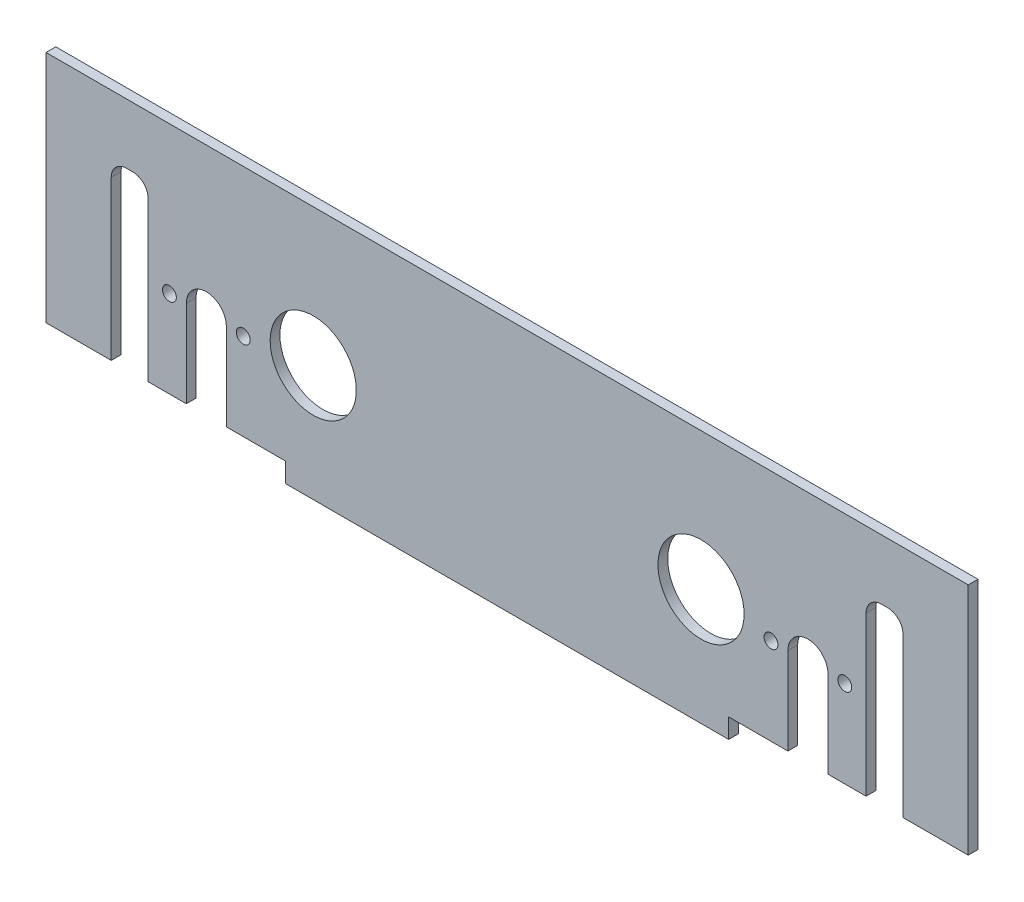
ISO-10303-21;
HEADER;
FILE_DESCRIPTION(('STEP AP214'),'2;1');
FILE_NAME('part.step','',(''),(''),'','','');
FILE_SCHEMA(('AUTOMOTIVE_DESIGN { 1 0 10303 214 1 1 1 1 }'));
ENDSEC;
DATA;
#1=APPLICATION_CONTEXT('core data for automotive mechanical design processes');
#2=APPLICATION_PROTOCOL_DEFINITION('international standard','automotive_design',2000,#1);
#3=PRODUCT_CONTEXT('',#1,'mechanical');
#4=PRODUCT('Part','Part','',(#3));
#5=PRODUCT_RELATED_PRODUCT_CATEGORY('part','',(#4));
#6=PRODUCT_DEFINITION_FORMATION('','',#4);
#7=PRODUCT_DEFINITION_CONTEXT('part definition',#1,'design');
#8=PRODUCT_DEFINITION('design','',#6,#7);
#9=PRODUCT_DEFINITION_SHAPE('','',#8);
#10=(LENGTH_UNIT() NAMED_UNIT(*) SI_UNIT(.MILLI.,.METRE.));
#11=(NAMED_UNIT(*) PLANE_ANGLE_UNIT() SI_UNIT($,.RADIAN.));
#12=(NAMED_UNIT(*) SI_UNIT($,.STERADIAN.) SOLID_ANGLE_UNIT());
#13=UNCERTAINTY_MEASURE_WITH_UNIT(LENGTH_MEASURE(1.E-05),#10,'distance_accuracy_value','');
#14=(GEOMETRIC_REPRESENTATION_CONTEXT(3) GLOBAL_UNCERTAINTY_ASSIGNED_CONTEXT((#13)) GLOBAL_UNIT_ASSIGNED_CONTEXT((#10,
#11,#12)) REPRESENTATION_CONTEXT('',''));
#15=CARTESIAN_POINT('',(0.,0.,0.));
#16=DIRECTION('',(0.,0.,1.));
#17=DIRECTION('',(1.,0.,0.));
#18=AXIS2_PLACEMENT_3D('',#15,#16,#17);
#19=CARTESIAN_POINT('',(-149.85,-38.0375,3.175));
#20=DIRECTION('',(0.,1.,0.));
#21=DIRECTION('',(0.,0.,1.));
#22=AXIS2_PLACEMENT_3D('',#19,#20,#21);
#23=PLANE('',#22);
#24=DIRECTION('',(0.,0.,1.));
#25=VECTOR('',#24,1.);
#26=CARTESIAN_POINT('',(72.,-38.0375,3.175));
#27=LINE('',#26,#25);
#28=CARTESIAN_POINT('',(72.,-38.0375,0.));
#29=VERTEX_POINT('',#28);
#30=CARTESIAN_POINT('',(72.,-38.0375,3.175));
#31=VERTEX_POINT('',#30);
#32=EDGE_CURVE('E252',#29,#31,#27,.T.);
#33=ORIENTED_EDGE('',*,*,#32,.F.);
#34=DIRECTION('',(1.,0.,0.));
#35=VECTOR('',#34,1.);
#36=CARTESIAN_POINT('',(-149.85,-38.0375,0.));
#37=LINE('',#36,#35);
#38=CARTESIAN_POINT('',(91.25,-38.0375,0.));
#39=VERTEX_POINT('',#38);
#40=EDGE_CURVE('E439',#29,#39,#37,.T.);
#41=ORIENTED_EDGE('',*,*,#40,.T.);
#42=DIRECTION('',(0.,0.,-1.));
#43=VECTOR('',#42,1.);
#44=CARTESIAN_POINT('',(91.25,-38.0375,3.175));
#45=LINE('',#44,#43);
#46=CARTESIAN_POINT('',(91.25,-38.0375,3.175));
#47=VERTEX_POINT('',#46);
#48=EDGE_CURVE('E305',#47,#39,#45,.T.);
#49=ORIENTED_EDGE('',*,*,#48,.F.);
#50=DIRECTION('',(1.,0.,0.));
#51=VECTOR('',#50,1.);
#52=CARTESIAN_POINT('',(-149.85,-38.0375,3.175));
#53=LINE('',#52,#51);
#54=EDGE_CURVE('E64',#31,#47,#53,.T.);
#55=ORIENTED_EDGE('',*,*,#54,.F.);
#56=EDGE_LOOP('',(#33,#41,#49,#55));
#57=FACE_BOUND('',#56,.T.);
#58=ADVANCED_FACE('F41',(#57),#23,.F.);
#59=DIRECTION('',(0.,0.,-1.));
#60=VECTOR('',#59,1.);
#61=CARTESIAN_POINT('',(-72.,-38.0375,3.175));
#62=LINE('',#61,#60);
#63=CARTESIAN_POINT('',(-72.,-38.0375,3.175));
#64=VERTEX_POINT('',#63);
#65=CARTESIAN_POINT('',(-72.,-38.0375,0.));
#66=VERTEX_POINT('',#65);
#67=EDGE_CURVE('E249',#64,#66,#62,.T.);
#68=ORIENTED_EDGE('',*,*,#67,.F.);
#69=CARTESIAN_POINT('',(-91.2500000000002,-38.0375,3.175));
#70=VERTEX_POINT('',#69);
#71=EDGE_CURVE('E486',#70,#64,#53,.T.);
#72=ORIENTED_EDGE('',*,*,#71,.F.);
#73=DIRECTION('',(0.,0.,-1.));
#74=VECTOR('',#73,1.);
#75=CARTESIAN_POINT('',(-91.2500000000002,-38.0375,3.175));
#76=LINE('',#75,#74);
#77=CARTESIAN_POINT('',(-91.2500000000002,-38.0375,0.));
#78=VERTEX_POINT('',#77);
#79=EDGE_CURVE('E331',#70,#78,#76,.T.);
#80=ORIENTED_EDGE('',*,*,#79,.T.);
#81=EDGE_CURVE('E56',#78,#66,#37,.T.);
#82=ORIENTED_EDGE('',*,*,#81,.T.);
#83=EDGE_LOOP('',(#68,#72,#80,#82));
#84=FACE_BOUND('',#83,.T.);
#85=ADVANCED_FACE('F508',(#84),#23,.F.);
#86=CARTESIAN_POINT('',(0.,0.,3.175));
#87=DIRECTION('',(0.,0.,1.));
#88=DIRECTION('',(1.,0.,0.));
#89=AXIS2_PLACEMENT_3D('',#86,#87,#88);
#90=PLANE('',#89);
#91=CARTESIAN_POINT('',(63.0088992226956,-6.64465154463759,3.17500000000054));
#92=DIRECTION('',(0.,0.,1.));
#93=DIRECTION('',(1.,0.,0.));
#94=AXIS2_PLACEMENT_3D('',#91,#92,#93);
#95=CIRCLE('',#94,14.);
#96=CARTESIAN_POINT('',(77.0088992226956,-6.64465154463759,3.17500000000054));
#97=VERTEX_POINT('',#96);
#98=EDGE_CURVE('E524',#97,#97,#95,.T.);
#99=ORIENTED_EDGE('',*,*,#98,.F.);
#100=EDGE_LOOP('',(#99));
#101=FACE_BOUND('',#100,.T.);
#102=CARTESIAN_POINT('',(-63.0088992226956,-6.64465154463759,3.17500000000054));
#103=DIRECTION('',(0.,0.,-1.));
#104=DIRECTION('',(-1.,0.,0.));
#105=AXIS2_PLACEMENT_3D('',#102,#103,#104);
#106=CIRCLE('',#105,14.);
#107=CARTESIAN_POINT('',(-77.0088992226956,-6.64465154463759,3.17500000000054));
#108=VERTEX_POINT('',#107);
#109=EDGE_CURVE('E513',#108,#108,#106,.T.);
#110=ORIENTED_EDGE('',*,*,#109,.T.);
#111=EDGE_LOOP('',(#110));
#112=FACE_BOUND('',#111,.T.);
#113=CARTESIAN_POINT('',(109.75,-9.7625,3.17500000000054));
#114=DIRECTION('',(0.,0.,-1.));
#115=DIRECTION('',(-1.,0.,0.));
#116=AXIS2_PLACEMENT_3D('',#113,#114,#115);
#117=CIRCLE('',#116,2.25);
#118=CARTESIAN_POINT('',(107.5,-9.7625,3.17500000000054));
#119=VERTEX_POINT('',#118);
#120=EDGE_CURVE('E267',#119,#119,#117,.T.);
#121=ORIENTED_EDGE('',*,*,#120,.T.);
#122=EDGE_LOOP('',(#121));
#123=FACE_BOUND('',#122,.T.);
#124=ORIENTED_EDGE('',*,*,#71,.T.);
#125=DIRECTION('',(0.,1.,0.));
#126=VECTOR('',#125,1.);
#127=CARTESIAN_POINT('',(-72.,-44.3875,3.175));
#128=LINE('',#127,#126);
#129=CARTESIAN_POINT('',(-72.,-44.3875,3.175));
#130=VERTEX_POINT('',#129);
#131=EDGE_CURVE('E236',#130,#64,#128,.T.);
#132=ORIENTED_EDGE('',*,*,#131,.F.);
#133=DIRECTION('',(-1.,0.,0.));
#134=VECTOR('',#133,1.);
#135=CARTESIAN_POINT('',(-72.,-44.3875,3.175));
#136=LINE('',#135,#134);
#137=CARTESIAN_POINT('',(72.,-44.3875,3.175));
#138=VERTEX_POINT('',#137);
#139=EDGE_CURVE('E227',#138,#130,#136,.T.);
#140=ORIENTED_EDGE('',*,*,#139,.F.);
#141=DIRECTION('',(0.,1.,0.));
#142=VECTOR('',#141,1.);
#143=CARTESIAN_POINT('',(72.,-44.3875,3.175));
#144=LINE('',#143,#142);
#145=EDGE_CURVE('E233',#138,#31,#144,.T.);
#146=ORIENTED_EDGE('',*,*,#145,.T.);
#147=ORIENTED_EDGE('',*,*,#54,.T.);
#148=DIRECTION('',(0.,-1.,0.));
#149=VECTOR('',#148,1.);
#150=CARTESIAN_POINT('',(91.25,0.,3.175));
#151=LINE('',#150,#149);
#152=CARTESIAN_POINT('',(91.25,-9.76249999999999,3.175));
#153=VERTEX_POINT('',#152);
#154=EDGE_CURVE('E290',#153,#47,#151,.T.);
#155=ORIENTED_EDGE('',*,*,#154,.F.);
#156=CARTESIAN_POINT('',(97.75,-9.76249999999999,3.175));
#157=DIRECTION('',(0.,0.,-1.));
#158=DIRECTION('',(-1.,0.,0.));
#159=AXIS2_PLACEMENT_3D('',#156,#157,#158);
#160=CIRCLE('',#159,6.5);
#161=CARTESIAN_POINT('',(104.25,-9.76249999999999,3.175));
#162=VERTEX_POINT('',#161);
#163=EDGE_CURVE('E283',#153,#162,#160,.T.);
#164=ORIENTED_EDGE('',*,*,#163,.T.);
#165=DIRECTION('',(0.,-1.,0.));
#166=VECTOR('',#165,1.);
#167=CARTESIAN_POINT('',(104.25,0.,3.175));
#168=LINE('',#167,#166);
#169=CARTESIAN_POINT('',(104.25,-38.0375,3.175));
#170=VERTEX_POINT('',#169);
#171=EDGE_CURVE('E286',#162,#170,#168,.T.);
#172=ORIENTED_EDGE('',*,*,#171,.T.);
#173=CARTESIAN_POINT('',(116.65,-38.0375,3.175));
#174=VERTEX_POINT('',#173);
#175=EDGE_CURVE('E487',#170,#174,#53,.T.);
#176=ORIENTED_EDGE('',*,*,#175,.T.);
#177=DIRECTION('',(0.,1.,0.));
#178=VECTOR('',#177,1.);
#179=CARTESIAN_POINT('',(116.65,0.,3.175));
#180=LINE('',#179,#178);
#181=CARTESIAN_POINT('',(116.65,13.5125,3.175));
#182=VERTEX_POINT('',#181);
#183=EDGE_CURVE('E363',#174,#182,#180,.T.);
#184=ORIENTED_EDGE('',*,*,#183,.T.);
#185=CARTESIAN_POINT('',(121.65,13.5125,3.175));
#186=DIRECTION('',(0.,0.,1.));
#187=DIRECTION('',(1.,0.,0.));
#188=AXIS2_PLACEMENT_3D('',#185,#186,#187);
#189=CIRCLE('',#188,5.00000000000001);
#190=CARTESIAN_POINT('',(121.65,18.5125,3.175));
#191=VERTEX_POINT('',#190);
#192=EDGE_CURVE('E377',#191,#182,#189,.T.);
#193=ORIENTED_EDGE('',*,*,#192,.F.);
#194=DIRECTION('',(1.,0.,0.));
#195=VECTOR('',#194,1.);
#196=CARTESIAN_POINT('',(0.,18.5125,3.175));
#197=LINE('',#196,#195);
#198=CARTESIAN_POINT('',(123.65,18.5125,3.175));
#199=VERTEX_POINT('',#198);
#200=EDGE_CURVE('E397',#191,#199,#197,.T.);
#201=ORIENTED_EDGE('',*,*,#200,.T.);
#202=CARTESIAN_POINT('',(123.65,13.5125,3.175));
#203=DIRECTION('',(0.,0.,1.));
#204=DIRECTION('',(1.,0.,0.));
#205=AXIS2_PLACEMENT_3D('',#202,#203,#204);
#206=CIRCLE('',#205,5.00000000000001);
#207=CARTESIAN_POINT('',(128.65,13.5125,3.175));
#208=VERTEX_POINT('',#207);
#209=EDGE_CURVE('E394',#208,#199,#206,.T.);
#210=ORIENTED_EDGE('',*,*,#209,.F.);
#211=DIRECTION('',(0.,1.,0.));
#212=VECTOR('',#211,1.);
#213=CARTESIAN_POINT('',(128.65,0.,3.175));
#214=LINE('',#213,#212);
#215=CARTESIAN_POINT('',(128.65,-38.0375,3.175));
#216=VERTEX_POINT('',#215);
#217=EDGE_CURVE('E391',#216,#208,#214,.T.);
#218=ORIENTED_EDGE('',*,*,#217,.F.);
#219=CARTESIAN_POINT('',(149.85,-38.0375,3.175));
#220=VERTEX_POINT('',#219);
#221=EDGE_CURVE('E423',#216,#220,#53,.T.);
#222=ORIENTED_EDGE('',*,*,#221,.T.);
#223=DIRECTION('',(0.,1.,0.));
#224=VECTOR('',#223,1.);
#225=CARTESIAN_POINT('',(149.85,38.0375,3.175));
#226=LINE('',#225,#224);
#227=CARTESIAN_POINT('',(149.85,38.0375,3.175));
#228=VERTEX_POINT('',#227);
#229=EDGE_CURVE('E415',#220,#228,#226,.T.);
#230=ORIENTED_EDGE('',*,*,#229,.T.);
#231=DIRECTION('',(-1.,0.,0.));
#232=VECTOR('',#231,1.);
#233=CARTESIAN_POINT('',(-149.85,38.0375,3.175));
#234=LINE('',#233,#232);
#235=CARTESIAN_POINT('',(-149.85,38.0375,3.175));
#236=VERTEX_POINT('',#235);
#237=EDGE_CURVE('E418',#228,#236,#234,.T.);
#238=ORIENTED_EDGE('',*,*,#237,.T.);
#239=DIRECTION('',(0.,-1.,0.));
#240=VECTOR('',#239,1.);
#241=CARTESIAN_POINT('',(-149.85,38.0375,3.175));
#242=LINE('',#241,#240);
#243=CARTESIAN_POINT('',(-149.85,-38.0375,3.175));
#244=VERTEX_POINT('',#243);
#245=EDGE_CURVE('E421',#236,#244,#242,.T.);
#246=ORIENTED_EDGE('',*,*,#245,.T.);
#247=CARTESIAN_POINT('',(-128.65,-38.0375,3.175));
#248=VERTEX_POINT('',#247);
#249=EDGE_CURVE('E424',#244,#248,#53,.T.);
#250=ORIENTED_EDGE('',*,*,#249,.T.);
#251=DIRECTION('',(0.,1.,0.));
#252=VECTOR('',#251,1.);
#253=CARTESIAN_POINT('',(-128.65,0.,3.175));
#254=LINE('',#253,#252);
#255=CARTESIAN_POINT('',(-128.65,13.5125,3.175));
#256=VERTEX_POINT('',#255);
#257=EDGE_CURVE('E338',#248,#256,#254,.T.);
#258=ORIENTED_EDGE('',*,*,#257,.T.);
#259=CARTESIAN_POINT('',(-123.65,13.5125,3.175));
#260=DIRECTION('',(0.,0.,-1.));
#261=DIRECTION('',(-1.,0.,0.));
#262=AXIS2_PLACEMENT_3D('',#259,#260,#261);
#263=CIRCLE('',#262,5.00000000000001);
#264=CARTESIAN_POINT('',(-123.65,18.5125,3.175));
#265=VERTEX_POINT('',#264);
#266=EDGE_CURVE('E356',#256,#265,#263,.T.);
#267=ORIENTED_EDGE('',*,*,#266,.T.);
#268=DIRECTION('',(-1.,0.,0.));
#269=VECTOR('',#268,1.);
#270=CARTESIAN_POINT('',(0.,18.5125,3.175));
#271=LINE('',#270,#269);
#272=CARTESIAN_POINT('',(-121.65,18.5125,3.175));
#273=VERTEX_POINT('',#272);
#274=EDGE_CURVE('E353',#273,#265,#271,.T.);
#275=ORIENTED_EDGE('',*,*,#274,.F.);
#276=CARTESIAN_POINT('',(-121.65,13.5125,3.175));
#277=DIRECTION('',(0.,0.,-1.));
#278=DIRECTION('',(-1.,0.,0.));
#279=AXIS2_PLACEMENT_3D('',#276,#277,#278);
#280=CIRCLE('',#279,5.00000000000001);
#281=CARTESIAN_POINT('',(-116.65,13.5125,3.175));
#282=VERTEX_POINT('',#281);
#283=EDGE_CURVE('E350',#273,#282,#280,.T.);
#284=ORIENTED_EDGE('',*,*,#283,.T.);
#285=DIRECTION('',(0.,1.,0.));
#286=VECTOR('',#285,1.);
#287=CARTESIAN_POINT('',(-116.65,0.,3.175));
#288=LINE('',#287,#286);
#289=CARTESIAN_POINT('',(-116.65,-38.0375,3.175));
#290=VERTEX_POINT('',#289);
#291=EDGE_CURVE('E304',#290,#282,#288,.T.);
#292=ORIENTED_EDGE('',*,*,#291,.F.);
#293=CARTESIAN_POINT('',(-104.25,-38.0375,3.175));
#294=VERTEX_POINT('',#293);
#295=EDGE_CURVE('E428',#290,#294,#53,.T.);
#296=ORIENTED_EDGE('',*,*,#295,.T.);
#297=DIRECTION('',(0.,-1.,0.));
#298=VECTOR('',#297,1.);
#299=CARTESIAN_POINT('',(-104.25,0.,3.175));
#300=LINE('',#299,#298);
#301=CARTESIAN_POINT('',(-104.25,-9.76250000000001,3.175));
#302=VERTEX_POINT('',#301);
#303=EDGE_CURVE('E319',#302,#294,#300,.T.);
#304=ORIENTED_EDGE('',*,*,#303,.F.);
#305=CARTESIAN_POINT('',(-97.7500000000002,-9.76250000000001,3.175));
#306=DIRECTION('',(0.,0.,-1.));
#307=DIRECTION('',(-1.,0.,0.));
#308=AXIS2_PLACEMENT_3D('',#305,#306,#307);
#309=CIRCLE('',#308,6.5);
#310=CARTESIAN_POINT('',(-91.2500000000002,-9.76250000000001,3.175));
#311=VERTEX_POINT('',#310);
#312=EDGE_CURVE('E312',#302,#311,#309,.T.);
#313=ORIENTED_EDGE('',*,*,#312,.T.);
#314=DIRECTION('',(0.,-1.,0.));
#315=VECTOR('',#314,1.);
#316=CARTESIAN_POINT('',(-91.2500000000002,0.,3.175));
#317=LINE('',#316,#315);
#318=EDGE_CURVE('E315',#311,#70,#317,.T.);
#319=ORIENTED_EDGE('',*,*,#318,.T.);
#320=EDGE_LOOP('',(#124,#132,#140,#146,#147,#155,#164,#172,#176,#184,#193,#201,#210,#218,#222,
#230,#238,#246,#250,#258,#267,#275,#284,#292,#296,#304,#313,#319));
#321=FACE_BOUND('',#320,.T.);
#322=CARTESIAN_POINT('',(-85.7500000000001,-9.76250000000003,3.17500000000054));
#323=DIRECTION('',(0.,0.,-1.));
#324=DIRECTION('',(-1.,0.,0.));
#325=AXIS2_PLACEMENT_3D('',#322,#323,#324);
#326=CIRCLE('',#325,2.25);
#327=CARTESIAN_POINT('',(-88.0000000000001,-9.76250000000003,3.17500000000054));
#328=VERTEX_POINT('',#327);
#329=EDGE_CURVE('E279',#328,#328,#326,.T.);
#330=ORIENTED_EDGE('',*,*,#329,.T.);
#331=EDGE_LOOP('',(#330));
#332=FACE_BOUND('',#331,.T.);
#333=CARTESIAN_POINT('',(-109.75,-9.76250000000003,3.17500000000054));
#334=DIRECTION('',(0.,0.,-1.));
#335=DIRECTION('',(-1.,0.,0.));
#336=AXIS2_PLACEMENT_3D('',#333,#334,#335);
#337=CIRCLE('',#336,2.25);
#338=CARTESIAN_POINT('',(-112.,-9.76250000000003,3.17500000000054));
#339=VERTEX_POINT('',#338);
#340=EDGE_CURVE('E273',#339,#339,#337,.T.);
#341=ORIENTED_EDGE('',*,*,#340,.T.);
#342=EDGE_LOOP('',(#341));
#343=FACE_BOUND('',#342,.T.);
#344=CARTESIAN_POINT('',(85.75,-9.7625,3.17500000000054));
#345=DIRECTION('',(0.,0.,-1.));
#346=DIRECTION('',(-1.,0.,0.));
#347=AXIS2_PLACEMENT_3D('',#344,#345,#346);
#348=CIRCLE('',#347,2.25);
#349=CARTESIAN_POINT('',(83.5,-9.7625,3.17500000000054));
#350=VERTEX_POINT('',#349);
#351=EDGE_CURVE('E256',#350,#350,#348,.T.);
#352=ORIENTED_EDGE('',*,*,#351,.T.);
#353=EDGE_LOOP('',(#352));
#354=FACE_BOUND('',#353,.T.);
#355=ADVANCED_FACE('F230',(#101,#112,#123,#321,#332,#343,#354),#90,.T.);
#356=CARTESIAN_POINT('',(0.,0.,0.));
#357=DIRECTION('',(0.,0.,1.));
#358=DIRECTION('',(1.,0.,0.));
#359=AXIS2_PLACEMENT_3D('',#356,#357,#358);
#360=PLANE('',#359);
#361=CARTESIAN_POINT('',(63.0088992226956,-6.64465154463759,0.));
#362=DIRECTION('',(0.,0.,1.));
#363=DIRECTION('',(1.,0.,0.));
#364=AXIS2_PLACEMENT_3D('',#361,#362,#363);
#365=CIRCLE('',#364,14.);
#366=CARTESIAN_POINT('',(77.0088992226956,-6.64465154463759,0.));
#367=VERTEX_POINT('',#366);
#368=EDGE_CURVE('E527',#367,#367,#365,.T.);
#369=ORIENTED_EDGE('',*,*,#368,.T.);
#370=EDGE_LOOP('',(#369));
#371=FACE_BOUND('',#370,.T.);
#372=CARTESIAN_POINT('',(-63.0088992226956,-6.64465154463759,0.));
#373=DIRECTION('',(0.,0.,-1.));
#374=DIRECTION('',(-1.,0.,0.));
#375=AXIS2_PLACEMENT_3D('',#372,#373,#374);
#376=CIRCLE('',#375,14.);
#377=CARTESIAN_POINT('',(-77.0088992226956,-6.64465154463759,0.));
#378=VERTEX_POINT('',#377);
#379=EDGE_CURVE('E521',#378,#378,#376,.T.);
#380=ORIENTED_EDGE('',*,*,#379,.F.);
#381=EDGE_LOOP('',(#380));
#382=FACE_BOUND('',#381,.T.);
#383=CARTESIAN_POINT('',(85.75,-9.7625,0.));
#384=DIRECTION('',(0.,0.,-1.));
#385=DIRECTION('',(-1.,0.,0.));
#386=AXIS2_PLACEMENT_3D('',#383,#384,#385);
#387=CIRCLE('',#386,2.25);
#388=CARTESIAN_POINT('',(83.5,-9.7625,0.));
#389=VERTEX_POINT('',#388);
#390=EDGE_CURVE('E253',#389,#389,#387,.T.);
#391=ORIENTED_EDGE('',*,*,#390,.F.);
#392=EDGE_LOOP('',(#391));
#393=FACE_BOUND('',#392,.T.);
#394=CARTESIAN_POINT('',(109.75,-9.7625,0.));
#395=DIRECTION('',(0.,0.,-1.));
#396=DIRECTION('',(-1.,0.,0.));
#397=AXIS2_PLACEMENT_3D('',#394,#395,#396);
#398=CIRCLE('',#397,2.25);
#399=CARTESIAN_POINT('',(107.5,-9.7625,0.));
#400=VERTEX_POINT('',#399);
#401=EDGE_CURVE('E264',#400,#400,#398,.T.);
#402=ORIENTED_EDGE('',*,*,#401,.F.);
#403=EDGE_LOOP('',(#402));
#404=FACE_BOUND('',#403,.T.);
#405=CARTESIAN_POINT('',(-109.75,-9.76250000000003,0.));
#406=DIRECTION('',(0.,0.,-1.));
#407=DIRECTION('',(-1.,0.,0.));
#408=AXIS2_PLACEMENT_3D('',#405,#406,#407);
#409=CIRCLE('',#408,2.25);
#410=CARTESIAN_POINT('',(-112.,-9.76250000000003,0.));
#411=VERTEX_POINT('',#410);
#412=EDGE_CURVE('E270',#411,#411,#409,.T.);
#413=ORIENTED_EDGE('',*,*,#412,.F.);
#414=EDGE_LOOP('',(#413));
#415=FACE_BOUND('',#414,.T.);
#416=CARTESIAN_POINT('',(-85.7500000000001,-9.76250000000003,0.));
#417=DIRECTION('',(0.,0.,-1.));
#418=DIRECTION('',(-1.,0.,0.));
#419=AXIS2_PLACEMENT_3D('',#416,#417,#418);
#420=CIRCLE('',#419,2.25);
#421=CARTESIAN_POINT('',(-88.0000000000001,-9.76250000000003,0.));
#422=VERTEX_POINT('',#421);
#423=EDGE_CURVE('E276',#422,#422,#420,.T.);
#424=ORIENTED_EDGE('',*,*,#423,.F.);
#425=EDGE_LOOP('',(#424));
#426=FACE_BOUND('',#425,.T.);
#427=DIRECTION('',(0.,-1.,0.));
#428=VECTOR('',#427,1.);
#429=CARTESIAN_POINT('',(91.25,0.,0.));
#430=LINE('',#429,#428);
#431=CARTESIAN_POINT('',(91.25,-9.76249999999999,0.));
#432=VERTEX_POINT('',#431);
#433=EDGE_CURVE('E287',#432,#39,#430,.T.);
#434=ORIENTED_EDGE('',*,*,#433,.T.);
#435=ORIENTED_EDGE('',*,*,#40,.F.);
#436=DIRECTION('',(0.,1.,0.));
#437=VECTOR('',#436,1.);
#438=CARTESIAN_POINT('',(72.,-44.3875,0.));
#439=LINE('',#438,#437);
#440=CARTESIAN_POINT('',(72.,-44.3875,0.));
#441=VERTEX_POINT('',#440);
#442=EDGE_CURVE('E517',#441,#29,#439,.T.);
#443=ORIENTED_EDGE('',*,*,#442,.F.);
#444=DIRECTION('',(1.,0.,0.));
#445=VECTOR('',#444,1.);
#446=CARTESIAN_POINT('',(-72.,-44.3875,0.));
#447=LINE('',#446,#445);
#448=CARTESIAN_POINT('',(-72.,-44.3875,0.));
#449=VERTEX_POINT('',#448);
#450=EDGE_CURVE('E245',#449,#441,#447,.T.);
#451=ORIENTED_EDGE('',*,*,#450,.F.);
#452=DIRECTION('',(0.,1.,0.));
#453=VECTOR('',#452,1.);
#454=CARTESIAN_POINT('',(-72.,-44.3875,0.));
#455=LINE('',#454,#453);
#456=EDGE_CURVE('E258',#449,#66,#455,.T.);
#457=ORIENTED_EDGE('',*,*,#456,.T.);
#458=ORIENTED_EDGE('',*,*,#81,.F.);
#459=DIRECTION('',(0.,-1.,0.));
#460=VECTOR('',#459,1.);
#461=CARTESIAN_POINT('',(-91.2500000000002,0.,0.));
#462=LINE('',#461,#460);
#463=CARTESIAN_POINT('',(-91.2500000000002,-9.76250000000001,0.));
#464=VERTEX_POINT('',#463);
#465=EDGE_CURVE('E324',#464,#78,#462,.T.);
#466=ORIENTED_EDGE('',*,*,#465,.F.);
#467=CARTESIAN_POINT('',(-97.7500000000002,-9.76250000000001,0.));
#468=DIRECTION('',(0.,0.,-1.));
#469=DIRECTION('',(-1.,0.,0.));
#470=AXIS2_PLACEMENT_3D('',#467,#468,#469);
#471=CIRCLE('',#470,6.5);
#472=CARTESIAN_POINT('',(-104.25,-9.76250000000001,0.));
#473=VERTEX_POINT('',#472);
#474=EDGE_CURVE('E282',#473,#464,#471,.T.);
#475=ORIENTED_EDGE('',*,*,#474,.F.);
#476=DIRECTION('',(0.,-1.,0.));
#477=VECTOR('',#476,1.);
#478=CARTESIAN_POINT('',(-104.25,0.,0.));
#479=LINE('',#478,#477);
#480=CARTESIAN_POINT('',(-104.25,-38.0375,0.));
#481=VERTEX_POINT('',#480);
#482=EDGE_CURVE('E316',#473,#481,#479,.T.);
#483=ORIENTED_EDGE('',*,*,#482,.T.);
#484=CARTESIAN_POINT('',(-116.65,-38.0375,0.));
#485=VERTEX_POINT('',#484);
#486=EDGE_CURVE('E438',#485,#481,#37,.T.);
#487=ORIENTED_EDGE('',*,*,#486,.F.);
#488=DIRECTION('',(0.,1.,0.));
#489=VECTOR('',#488,1.);
#490=CARTESIAN_POINT('',(-116.65,0.,0.));
#491=LINE('',#490,#489);
#492=CARTESIAN_POINT('',(-116.65,13.5125,0.));
#493=VERTEX_POINT('',#492);
#494=EDGE_CURVE('E334',#485,#493,#491,.T.);
#495=ORIENTED_EDGE('',*,*,#494,.T.);
#496=CARTESIAN_POINT('',(-121.65,13.5125,0.));
#497=DIRECTION('',(0.,0.,-1.));
#498=DIRECTION('',(-1.,0.,0.));
#499=AXIS2_PLACEMENT_3D('',#496,#497,#498);
#500=CIRCLE('',#499,5.00000000000001);
#501=CARTESIAN_POINT('',(-121.65,18.5125,0.));
#502=VERTEX_POINT('',#501);
#503=EDGE_CURVE('E337',#502,#493,#500,.T.);
#504=ORIENTED_EDGE('',*,*,#503,.F.);
#505=DIRECTION('',(-1.,0.,0.));
#506=VECTOR('',#505,1.);
#507=CARTESIAN_POINT('',(0.,18.5125,0.));
#508=LINE('',#507,#506);
#509=CARTESIAN_POINT('',(-123.65,18.5125,0.));
#510=VERTEX_POINT('',#509);
#511=EDGE_CURVE('E340',#502,#510,#508,.T.);
#512=ORIENTED_EDGE('',*,*,#511,.T.);
#513=CARTESIAN_POINT('',(-123.65,13.5125,0.));
#514=DIRECTION('',(0.,0.,-1.));
#515=DIRECTION('',(-1.,0.,0.));
#516=AXIS2_PLACEMENT_3D('',#513,#514,#515);
#517=CIRCLE('',#516,5.00000000000001);
#518=CARTESIAN_POINT('',(-128.65,13.5125,0.));
#519=VERTEX_POINT('',#518);
#520=EDGE_CURVE('E343',#519,#510,#517,.T.);
#521=ORIENTED_EDGE('',*,*,#520,.F.);
#522=DIRECTION('',(0.,1.,0.));
#523=VECTOR('',#522,1.);
#524=CARTESIAN_POINT('',(-128.65,0.,0.));
#525=LINE('',#524,#523);
#526=CARTESIAN_POINT('',(-128.65,-38.0375,0.));
#527=VERTEX_POINT('',#526);
#528=EDGE_CURVE('E345',#527,#519,#525,.T.);
#529=ORIENTED_EDGE('',*,*,#528,.F.);
#530=CARTESIAN_POINT('',(-149.85,-38.0375,0.));
#531=VERTEX_POINT('',#530);
#532=EDGE_CURVE('E419',#531,#527,#37,.T.);
#533=ORIENTED_EDGE('',*,*,#532,.F.);
#534=DIRECTION('',(0.,-1.,0.));
#535=VECTOR('',#534,1.);
#536=CARTESIAN_POINT('',(-149.85,38.0375,0.));
#537=LINE('',#536,#535);
#538=CARTESIAN_POINT('',(-149.85,38.0375,0.));
#539=VERTEX_POINT('',#538);
#540=EDGE_CURVE('E433',#539,#531,#537,.T.);
#541=ORIENTED_EDGE('',*,*,#540,.F.);
#542=DIRECTION('',(-1.,0.,0.));
#543=VECTOR('',#542,1.);
#544=CARTESIAN_POINT('',(-149.85,38.0375,0.));
#545=LINE('',#544,#543);
#546=CARTESIAN_POINT('',(149.85,38.0375,0.));
#547=VERTEX_POINT('',#546);
#548=EDGE_CURVE('E431',#547,#539,#545,.T.);
#549=ORIENTED_EDGE('',*,*,#548,.F.);
#550=DIRECTION('',(0.,1.,0.));
#551=VECTOR('',#550,1.);
#552=CARTESIAN_POINT('',(149.85,38.0375,0.));
#553=LINE('',#552,#551);
#554=CARTESIAN_POINT('',(149.85,-38.0375,0.));
#555=VERTEX_POINT('',#554);
#556=EDGE_CURVE('E404',#555,#547,#553,.T.);
#557=ORIENTED_EDGE('',*,*,#556,.F.);
#558=CARTESIAN_POINT('',(128.65,-38.0375,0.));
#559=VERTEX_POINT('',#558);
#560=EDGE_CURVE('E435',#559,#555,#37,.T.);
#561=ORIENTED_EDGE('',*,*,#560,.F.);
#562=DIRECTION('',(0.,1.,0.));
#563=VECTOR('',#562,1.);
#564=CARTESIAN_POINT('',(128.65,0.,0.));
#565=LINE('',#564,#563);
#566=CARTESIAN_POINT('',(128.65,13.5125,0.));
#567=VERTEX_POINT('',#566);
#568=EDGE_CURVE('E376',#559,#567,#565,.T.);
#569=ORIENTED_EDGE('',*,*,#568,.T.);
#570=CARTESIAN_POINT('',(123.65,13.5125,0.));
#571=DIRECTION('',(0.,0.,1.));
#572=DIRECTION('',(1.,0.,0.));
#573=AXIS2_PLACEMENT_3D('',#570,#571,#572);
#574=CIRCLE('',#573,5.00000000000001);
#575=CARTESIAN_POINT('',(123.65,18.5125,0.));
#576=VERTEX_POINT('',#575);
#577=EDGE_CURVE('E380',#567,#576,#574,.T.);
#578=ORIENTED_EDGE('',*,*,#577,.T.);
#579=DIRECTION('',(1.,0.,0.));
#580=VECTOR('',#579,1.);
#581=CARTESIAN_POINT('',(0.,18.5125,0.));
#582=LINE('',#581,#580);
#583=CARTESIAN_POINT('',(121.65,18.5125,0.));
#584=VERTEX_POINT('',#583);
#585=EDGE_CURVE('E383',#584,#576,#582,.T.);
#586=ORIENTED_EDGE('',*,*,#585,.F.);
#587=CARTESIAN_POINT('',(121.65,13.5125,0.));
#588=DIRECTION('',(0.,0.,1.));
#589=DIRECTION('',(1.,0.,0.));
#590=AXIS2_PLACEMENT_3D('',#587,#588,#589);
#591=CIRCLE('',#590,5.00000000000001);
#592=CARTESIAN_POINT('',(116.65,13.5125,0.));
#593=VERTEX_POINT('',#592);
#594=EDGE_CURVE('E385',#584,#593,#591,.T.);
#595=ORIENTED_EDGE('',*,*,#594,.T.);
#596=DIRECTION('',(0.,1.,0.));
#597=VECTOR('',#596,1.);
#598=CARTESIAN_POINT('',(116.65,0.,0.));
#599=LINE('',#598,#597);
#600=CARTESIAN_POINT('',(116.65,-38.0375,0.));
#601=VERTEX_POINT('',#600);
#602=EDGE_CURVE('E374',#601,#593,#599,.T.);
#603=ORIENTED_EDGE('',*,*,#602,.F.);
#604=CARTESIAN_POINT('',(104.25,-38.0375,0.));
#605=VERTEX_POINT('',#604);
#606=EDGE_CURVE('E469',#605,#601,#37,.T.);
#607=ORIENTED_EDGE('',*,*,#606,.F.);
#608=DIRECTION('',(0.,-1.,0.));
#609=VECTOR('',#608,1.);
#610=CARTESIAN_POINT('',(104.25,0.,0.));
#611=LINE('',#610,#609);
#612=CARTESIAN_POINT('',(104.25,-9.76249999999999,0.));
#613=VERTEX_POINT('',#612);
#614=EDGE_CURVE('E297',#613,#605,#611,.T.);
#615=ORIENTED_EDGE('',*,*,#614,.F.);
#616=CARTESIAN_POINT('',(97.75,-9.76249999999999,0.));
#617=DIRECTION('',(0.,0.,-1.));
#618=DIRECTION('',(-1.,0.,0.));
#619=AXIS2_PLACEMENT_3D('',#616,#617,#618);
#620=CIRCLE('',#619,6.5);
#621=EDGE_CURVE('E294',#432,#613,#620,.T.);
#622=ORIENTED_EDGE('',*,*,#621,.F.);
#623=EDGE_LOOP('',(#434,#435,#443,#451,#457,#458,#466,#475,#483,#487,#495,#504,#512,#521,#529,
#533,#541,#549,#557,#561,#569,#578,#586,#595,#603,#607,#615,#622));
#624=FACE_BOUND('',#623,.T.);
#625=ADVANCED_FACE('F454',(#371,#382,#393,#404,#415,#426,#624),#360,.F.);
#626=DIRECTION('',(0.,0.,-1.));
#627=VECTOR('',#626,1.);
#628=CARTESIAN_POINT('',(-104.25,-38.0375,3.175));
#629=LINE('',#628,#627);
#630=EDGE_CURVE('E329',#294,#481,#629,.T.);
#631=ORIENTED_EDGE('',*,*,#630,.F.);
#632=ORIENTED_EDGE('',*,*,#295,.F.);
#633=DIRECTION('',(0.,0.,1.));
#634=VECTOR('',#633,1.);
#635=CARTESIAN_POINT('',(-116.65,-38.0375,0.));
#636=LINE('',#635,#634);
#637=EDGE_CURVE('E361',#485,#290,#636,.T.);
#638=ORIENTED_EDGE('',*,*,#637,.F.);
#639=ORIENTED_EDGE('',*,*,#486,.T.);
#640=EDGE_LOOP('',(#631,#632,#638,#639));
#641=FACE_BOUND('',#640,.T.);
#642=ADVANCED_FACE('F496',(#641),#23,.F.);
#643=DIRECTION('',(0.,0.,1.));
#644=VECTOR('',#643,1.);
#645=CARTESIAN_POINT('',(-128.65,-38.0375,0.));
#646=LINE('',#645,#644);
#647=EDGE_CURVE('E364',#527,#248,#646,.T.);
#648=ORIENTED_EDGE('',*,*,#647,.T.);
#649=ORIENTED_EDGE('',*,*,#249,.F.);
#650=DIRECTION('',(0.,0.,-1.));
#651=VECTOR('',#650,1.);
#652=CARTESIAN_POINT('',(-149.85,-38.0375,3.175));
#653=LINE('',#652,#651);
#654=EDGE_CURVE('E442',#244,#531,#653,.T.);
#655=ORIENTED_EDGE('',*,*,#654,.T.);
#656=ORIENTED_EDGE('',*,*,#532,.T.);
#657=EDGE_LOOP('',(#648,#649,#655,#656));
#658=FACE_BOUND('',#657,.T.);
#659=ADVANCED_FACE('F459',(#658),#23,.F.);
#660=ORIENTED_EDGE('',*,*,#175,.F.);
#661=DIRECTION('',(0.,0.,-1.));
#662=VECTOR('',#661,1.);
#663=CARTESIAN_POINT('',(104.25,-38.0375,3.175));
#664=LINE('',#663,#662);
#665=EDGE_CURVE('E308',#170,#605,#664,.T.);
#666=ORIENTED_EDGE('',*,*,#665,.T.);
#667=ORIENTED_EDGE('',*,*,#606,.T.);
#668=DIRECTION('',(0.,0.,1.));
#669=VECTOR('',#668,1.);
#670=CARTESIAN_POINT('',(116.65,-38.0375,0.));
#671=LINE('',#670,#669);
#672=EDGE_CURVE('E388',#601,#174,#671,.T.);
#673=ORIENTED_EDGE('',*,*,#672,.T.);
#674=EDGE_LOOP('',(#660,#666,#667,#673));
#675=FACE_BOUND('',#674,.T.);
#676=ADVANCED_FACE('F584',(#675),#23,.F.);
#677=CARTESIAN_POINT('',(149.85,38.0375,3.175));
#678=DIRECTION('',(-1.,0.,0.));
#679=DIRECTION('',(0.,0.,1.));
#680=AXIS2_PLACEMENT_3D('',#677,#678,#679);
#681=PLANE('',#680);
#682=ORIENTED_EDGE('',*,*,#556,.T.);
#683=DIRECTION('',(0.,0.,-1.));
#684=VECTOR('',#683,1.);
#685=CARTESIAN_POINT('',(149.85,38.0375,3.175));
#686=LINE('',#685,#684);
#687=EDGE_CURVE('E11',#228,#547,#686,.T.);
#688=ORIENTED_EDGE('',*,*,#687,.F.);
#689=ORIENTED_EDGE('',*,*,#229,.F.);
#690=DIRECTION('',(0.,0.,-1.));
#691=VECTOR('',#690,1.);
#692=CARTESIAN_POINT('',(149.85,-38.0375,3.175));
#693=LINE('',#692,#691);
#694=EDGE_CURVE('E427',#220,#555,#693,.T.);
#695=ORIENTED_EDGE('',*,*,#694,.T.);
#696=EDGE_LOOP('',(#682,#688,#689,#695));
#697=FACE_BOUND('',#696,.T.);
#698=ADVANCED_FACE('F43',(#697),#681,.F.);
#699=CARTESIAN_POINT('',(-149.85,38.0375,3.175));
#700=DIRECTION('',(0.,-1.,0.));
#701=DIRECTION('',(0.,0.,-1.));
#702=AXIS2_PLACEMENT_3D('',#699,#700,#701);
#703=PLANE('',#702);
#704=ORIENTED_EDGE('',*,*,#548,.T.);
#705=DIRECTION('',(0.,0.,-1.));
#706=VECTOR('',#705,1.);
#707=CARTESIAN_POINT('',(-149.85,38.0375,3.175));
#708=LINE('',#707,#706);
#709=EDGE_CURVE('E49',#236,#539,#708,.T.);
#710=ORIENTED_EDGE('',*,*,#709,.F.);
#711=ORIENTED_EDGE('',*,*,#237,.F.);
#712=ORIENTED_EDGE('',*,*,#687,.T.);
#713=EDGE_LOOP('',(#704,#710,#711,#712));
#714=FACE_BOUND('',#713,.T.);
#715=ADVANCED_FACE('F463',(#714),#703,.F.);
#716=CARTESIAN_POINT('',(-149.85,38.0375,3.175));
#717=DIRECTION('',(1.,0.,0.));
#718=DIRECTION('',(0.,0.,-1.));
#719=AXIS2_PLACEMENT_3D('',#716,#717,#718);
#720=PLANE('',#719);
#721=ORIENTED_EDGE('',*,*,#540,.T.);
#722=ORIENTED_EDGE('',*,*,#654,.F.);
#723=ORIENTED_EDGE('',*,*,#245,.F.);
#724=ORIENTED_EDGE('',*,*,#709,.T.);
#725=EDGE_LOOP('',(#721,#722,#723,#724));
#726=FACE_BOUND('',#725,.T.);
#727=ADVANCED_FACE('F449',(#726),#720,.F.);
#728=ORIENTED_EDGE('',*,*,#221,.F.);
#729=DIRECTION('',(0.,0.,1.));
#730=VECTOR('',#729,1.);
#731=CARTESIAN_POINT('',(128.65,-38.0375,0.));
#732=LINE('',#731,#730);
#733=EDGE_CURVE('E411',#559,#216,#732,.T.);
#734=ORIENTED_EDGE('',*,*,#733,.F.);
#735=ORIENTED_EDGE('',*,*,#560,.T.);
#736=ORIENTED_EDGE('',*,*,#694,.F.);
#737=EDGE_LOOP('',(#728,#734,#735,#736));
#738=FACE_BOUND('',#737,.T.);
#739=ADVANCED_FACE('F576',(#738),#23,.F.);
#740=CARTESIAN_POINT('',(116.65,0.,0.));
#741=DIRECTION('',(1.,0.,0.));
#742=DIRECTION('',(0.,1.,0.));
#743=AXIS2_PLACEMENT_3D('',#740,#741,#742);
#744=PLANE('',#743);
#745=ORIENTED_EDGE('',*,*,#183,.F.);
#746=ORIENTED_EDGE('',*,*,#672,.F.);
#747=ORIENTED_EDGE('',*,*,#602,.T.);
#748=DIRECTION('',(0.,0.,1.));
#749=VECTOR('',#748,1.);
#750=CARTESIAN_POINT('',(116.65,13.5125,0.));
#751=LINE('',#750,#749);
#752=EDGE_CURVE('E402',#593,#182,#751,.T.);
#753=ORIENTED_EDGE('',*,*,#752,.T.);
#754=EDGE_LOOP('',(#745,#746,#747,#753));
#755=FACE_BOUND('',#754,.T.);
#756=ADVANCED_FACE('F583',(#755),#744,.T.);
#757=CARTESIAN_POINT('',(121.65,13.5125,0.));
#758=DIRECTION('',(0.,0.,1.));
#759=DIRECTION('',(1.,0.,0.));
#760=AXIS2_PLACEMENT_3D('',#757,#758,#759);
#761=CYLINDRICAL_SURFACE('',#760,5.00000000000001);
#762=ORIENTED_EDGE('',*,*,#192,.T.);
#763=ORIENTED_EDGE('',*,*,#752,.F.);
#764=ORIENTED_EDGE('',*,*,#594,.F.);
#765=DIRECTION('',(0.,0.,1.));
#766=VECTOR('',#765,1.);
#767=CARTESIAN_POINT('',(121.65,18.5125,0.));
#768=LINE('',#767,#766);
#769=EDGE_CURVE('E405',#584,#191,#768,.T.);
#770=ORIENTED_EDGE('',*,*,#769,.T.);
#771=EDGE_LOOP('',(#762,#763,#764,#770));
#772=FACE_BOUND('',#771,.T.);
#773=ADVANCED_FACE('F589',(#772),#761,.F.);
#774=CARTESIAN_POINT('',(0.,18.5125,0.));
#775=DIRECTION('',(0.,-1.,0.));
#776=DIRECTION('',(0.,0.,-1.));
#777=AXIS2_PLACEMENT_3D('',#774,#775,#776);
#778=PLANE('',#777);
#779=ORIENTED_EDGE('',*,*,#200,.F.);
#780=ORIENTED_EDGE('',*,*,#769,.F.);
#781=ORIENTED_EDGE('',*,*,#585,.T.);
#782=DIRECTION('',(0.,0.,1.));
#783=VECTOR('',#782,1.);
#784=CARTESIAN_POINT('',(123.65,18.5125,0.));
#785=LINE('',#784,#783);
#786=EDGE_CURVE('E407',#576,#199,#785,.T.);
#787=ORIENTED_EDGE('',*,*,#786,.T.);
#788=EDGE_LOOP('',(#779,#780,#781,#787));
#789=FACE_BOUND('',#788,.T.);
#790=ADVANCED_FACE('F610',(#789),#778,.T.);
#791=CARTESIAN_POINT('',(123.65,13.5125,0.));
#792=DIRECTION('',(0.,0.,1.));
#793=DIRECTION('',(1.,0.,0.));
#794=AXIS2_PLACEMENT_3D('',#791,#792,#793);
#795=CYLINDRICAL_SURFACE('',#794,5.00000000000001);
#796=ORIENTED_EDGE('',*,*,#209,.T.);
#797=ORIENTED_EDGE('',*,*,#786,.F.);
#798=ORIENTED_EDGE('',*,*,#577,.F.);
#799=DIRECTION('',(0.,0.,1.));
#800=VECTOR('',#799,1.);
#801=CARTESIAN_POINT('',(128.65,13.5125,0.));
#802=LINE('',#801,#800);
#803=EDGE_CURVE('E409',#567,#208,#802,.T.);
#804=ORIENTED_EDGE('',*,*,#803,.T.);
#805=EDGE_LOOP('',(#796,#797,#798,#804));
#806=FACE_BOUND('',#805,.T.);
#807=ADVANCED_FACE('F613',(#806),#795,.F.);
#808=CARTESIAN_POINT('',(128.65,0.,0.));
#809=DIRECTION('',(1.,0.,0.));
#810=DIRECTION('',(0.,1.,0.));
#811=AXIS2_PLACEMENT_3D('',#808,#809,#810);
#812=PLANE('',#811);
#813=ORIENTED_EDGE('',*,*,#217,.T.);
#814=ORIENTED_EDGE('',*,*,#803,.F.);
#815=ORIENTED_EDGE('',*,*,#568,.F.);
#816=ORIENTED_EDGE('',*,*,#733,.T.);
#817=EDGE_LOOP('',(#813,#814,#815,#816));
#818=FACE_BOUND('',#817,.T.);
#819=ADVANCED_FACE('F616',(#818),#812,.F.);
#820=CARTESIAN_POINT('',(-116.65,0.,0.));
#821=DIRECTION('',(1.,0.,0.));
#822=DIRECTION('',(0.,1.,0.));
#823=AXIS2_PLACEMENT_3D('',#820,#821,#822);
#824=PLANE('',#823);
#825=ORIENTED_EDGE('',*,*,#291,.T.);
#826=DIRECTION('',(0.,0.,1.));
#827=VECTOR('',#826,1.);
#828=CARTESIAN_POINT('',(-116.65,13.5125,0.));
#829=LINE('',#828,#827);
#830=EDGE_CURVE('E347',#493,#282,#829,.T.);
#831=ORIENTED_EDGE('',*,*,#830,.F.);
#832=ORIENTED_EDGE('',*,*,#494,.F.);
#833=ORIENTED_EDGE('',*,*,#637,.T.);
#834=EDGE_LOOP('',(#825,#831,#832,#833));
#835=FACE_BOUND('',#834,.T.);
#836=ADVANCED_FACE('F618',(#835),#824,.F.);
#837=CARTESIAN_POINT('',(-128.65,0.,0.));
#838=DIRECTION('',(1.,0.,0.));
#839=DIRECTION('',(0.,1.,0.));
#840=AXIS2_PLACEMENT_3D('',#837,#838,#839);
#841=PLANE('',#840);
#842=ORIENTED_EDGE('',*,*,#257,.F.);
#843=ORIENTED_EDGE('',*,*,#647,.F.);
#844=ORIENTED_EDGE('',*,*,#528,.T.);
#845=DIRECTION('',(0.,0.,1.));
#846=VECTOR('',#845,1.);
#847=CARTESIAN_POINT('',(-128.65,13.5125,0.));
#848=LINE('',#847,#846);
#849=EDGE_CURVE('E367',#519,#256,#848,.T.);
#850=ORIENTED_EDGE('',*,*,#849,.T.);
#851=EDGE_LOOP('',(#842,#843,#844,#850));
#852=FACE_BOUND('',#851,.T.);
#853=ADVANCED_FACE('F624',(#852),#841,.T.);
#854=CARTESIAN_POINT('',(-123.65,13.5125,0.));
#855=DIRECTION('',(0.,0.,1.));
#856=DIRECTION('',(1.,0.,0.));
#857=AXIS2_PLACEMENT_3D('',#854,#855,#856);
#858=CYLINDRICAL_SURFACE('',#857,5.00000000000001);
#859=ORIENTED_EDGE('',*,*,#266,.F.);
#860=ORIENTED_EDGE('',*,*,#849,.F.);
#861=ORIENTED_EDGE('',*,*,#520,.T.);
#862=DIRECTION('',(0.,0.,1.));
#863=VECTOR('',#862,1.);
#864=CARTESIAN_POINT('',(-123.65,18.5125,0.));
#865=LINE('',#864,#863);
#866=EDGE_CURVE('E369',#510,#265,#865,.T.);
#867=ORIENTED_EDGE('',*,*,#866,.T.);
#868=EDGE_LOOP('',(#859,#860,#861,#867));
#869=FACE_BOUND('',#868,.T.);
#870=ADVANCED_FACE('F640',(#869),#858,.F.);
#871=CARTESIAN_POINT('',(0.,18.5125,0.));
#872=DIRECTION('',(0.,1.,0.));
#873=DIRECTION('',(0.,0.,1.));
#874=AXIS2_PLACEMENT_3D('',#871,#872,#873);
#875=PLANE('',#874);
#876=ORIENTED_EDGE('',*,*,#274,.T.);
#877=ORIENTED_EDGE('',*,*,#866,.F.);
#878=ORIENTED_EDGE('',*,*,#511,.F.);
#879=DIRECTION('',(0.,0.,1.));
#880=VECTOR('',#879,1.);
#881=CARTESIAN_POINT('',(-121.65,18.5125,0.));
#882=LINE('',#881,#880);
#883=EDGE_CURVE('E371',#502,#273,#882,.T.);
#884=ORIENTED_EDGE('',*,*,#883,.T.);
#885=EDGE_LOOP('',(#876,#877,#878,#884));
#886=FACE_BOUND('',#885,.T.);
#887=ADVANCED_FACE('F636',(#886),#875,.F.);
#888=CARTESIAN_POINT('',(-121.65,13.5125,0.));
#889=DIRECTION('',(0.,0.,1.));
#890=DIRECTION('',(1.,0.,0.));
#891=AXIS2_PLACEMENT_3D('',#888,#889,#890);
#892=CYLINDRICAL_SURFACE('',#891,5.00000000000001);
#893=ORIENTED_EDGE('',*,*,#283,.F.);
#894=ORIENTED_EDGE('',*,*,#883,.F.);
#895=ORIENTED_EDGE('',*,*,#503,.T.);
#896=ORIENTED_EDGE('',*,*,#830,.T.);
#897=EDGE_LOOP('',(#893,#894,#895,#896));
#898=FACE_BOUND('',#897,.T.);
#899=ADVANCED_FACE('F633',(#898),#892,.F.);
#900=CARTESIAN_POINT('',(-97.7500000000002,-9.76250000000001,3.175));
#901=DIRECTION('',(0.,0.,-1.));
#902=DIRECTION('',(-1.,0.,0.));
#903=AXIS2_PLACEMENT_3D('',#900,#901,#902);
#904=CYLINDRICAL_SURFACE('',#903,6.5);
#905=ORIENTED_EDGE('',*,*,#474,.T.);
#906=DIRECTION('',(0.,0.,-1.));
#907=VECTOR('',#906,1.);
#908=CARTESIAN_POINT('',(-91.2500000000002,-9.76250000000001,3.175));
#909=LINE('',#908,#907);
#910=EDGE_CURVE('E321',#311,#464,#909,.T.);
#911=ORIENTED_EDGE('',*,*,#910,.F.);
#912=ORIENTED_EDGE('',*,*,#312,.F.);
#913=DIRECTION('',(0.,0.,-1.));
#914=VECTOR('',#913,1.);
#915=CARTESIAN_POINT('',(-104.25,-9.76250000000001,3.175));
#916=LINE('',#915,#914);
#917=EDGE_CURVE('E298',#302,#473,#916,.T.);
#918=ORIENTED_EDGE('',*,*,#917,.T.);
#919=EDGE_LOOP('',(#905,#911,#912,#918));
#920=FACE_BOUND('',#919,.T.);
#921=ADVANCED_FACE('F503',(#920),#904,.F.);
#922=CARTESIAN_POINT('',(-104.25,0.,3.175));
#923=DIRECTION('',(1.,0.,0.));
#924=DIRECTION('',(0.,1.,0.));
#925=AXIS2_PLACEMENT_3D('',#922,#923,#924);
#926=PLANE('',#925);
#927=ORIENTED_EDGE('',*,*,#482,.F.);
#928=ORIENTED_EDGE('',*,*,#917,.F.);
#929=ORIENTED_EDGE('',*,*,#303,.T.);
#930=ORIENTED_EDGE('',*,*,#630,.T.);
#931=EDGE_LOOP('',(#927,#928,#929,#930));
#932=FACE_BOUND('',#931,.T.);
#933=ADVANCED_FACE('F499',(#932),#926,.T.);
#934=CARTESIAN_POINT('',(-91.2500000000002,0.,3.175));
#935=DIRECTION('',(1.,0.,0.));
#936=DIRECTION('',(0.,0.,-1.));
#937=AXIS2_PLACEMENT_3D('',#934,#935,#936);
#938=PLANE('',#937);
#939=ORIENTED_EDGE('',*,*,#465,.T.);
#940=ORIENTED_EDGE('',*,*,#79,.F.);
#941=ORIENTED_EDGE('',*,*,#318,.F.);
#942=ORIENTED_EDGE('',*,*,#910,.T.);
#943=EDGE_LOOP('',(#939,#940,#941,#942));
#944=FACE_BOUND('',#943,.T.);
#945=ADVANCED_FACE('F649',(#944),#938,.F.);
#946=CARTESIAN_POINT('',(97.75,-9.76249999999999,3.175));
#947=DIRECTION('',(0.,0.,-1.));
#948=DIRECTION('',(-1.,0.,0.));
#949=AXIS2_PLACEMENT_3D('',#946,#947,#948);
#950=CYLINDRICAL_SURFACE('',#949,6.5);
#951=ORIENTED_EDGE('',*,*,#621,.T.);
#952=DIRECTION('',(0.,0.,-1.));
#953=VECTOR('',#952,1.);
#954=CARTESIAN_POINT('',(104.25,-9.76249999999999,3.175));
#955=LINE('',#954,#953);
#956=EDGE_CURVE('E293',#162,#613,#955,.T.);
#957=ORIENTED_EDGE('',*,*,#956,.F.);
#958=ORIENTED_EDGE('',*,*,#163,.F.);
#959=DIRECTION('',(0.,0.,-1.));
#960=VECTOR('',#959,1.);
#961=CARTESIAN_POINT('',(91.25,-9.76249999999999,3.175));
#962=LINE('',#961,#960);
#963=EDGE_CURVE('E302',#153,#432,#962,.T.);
#964=ORIENTED_EDGE('',*,*,#963,.T.);
#965=EDGE_LOOP('',(#951,#957,#958,#964));
#966=FACE_BOUND('',#965,.T.);
#967=ADVANCED_FACE('F483',(#966),#950,.F.);
#968=CARTESIAN_POINT('',(91.25,0.,3.175));
#969=DIRECTION('',(1.,0.,0.));
#970=DIRECTION('',(0.,1.,0.));
#971=AXIS2_PLACEMENT_3D('',#968,#969,#970);
#972=PLANE('',#971);
#973=ORIENTED_EDGE('',*,*,#433,.F.);
#974=ORIENTED_EDGE('',*,*,#963,.F.);
#975=ORIENTED_EDGE('',*,*,#154,.T.);
#976=ORIENTED_EDGE('',*,*,#48,.T.);
#977=EDGE_LOOP('',(#973,#974,#975,#976));
#978=FACE_BOUND('',#977,.T.);
#979=ADVANCED_FACE('F477',(#978),#972,.T.);
#980=CARTESIAN_POINT('',(104.25,0.,3.175));
#981=DIRECTION('',(1.,0.,0.));
#982=DIRECTION('',(0.,0.,-1.));
#983=AXIS2_PLACEMENT_3D('',#980,#981,#982);
#984=PLANE('',#983);
#985=ORIENTED_EDGE('',*,*,#614,.T.);
#986=ORIENTED_EDGE('',*,*,#665,.F.);
#987=ORIENTED_EDGE('',*,*,#171,.F.);
#988=ORIENTED_EDGE('',*,*,#956,.T.);
#989=EDGE_LOOP('',(#985,#986,#987,#988));
#990=FACE_BOUND('',#989,.T.);
#991=ADVANCED_FACE('F561',(#990),#984,.F.);
#992=CARTESIAN_POINT('',(-85.7500000000001,-9.76250000000003,0.));
#993=DIRECTION('',(0.,0.,-1.));
#994=DIRECTION('',(-1.,0.,0.));
#995=AXIS2_PLACEMENT_3D('',#992,#993,#994);
#996=CYLINDRICAL_SURFACE('',#995,2.25);
#997=ORIENTED_EDGE('',*,*,#329,.F.);
#998=EDGE_LOOP('',(#997));
#999=FACE_BOUND('',#998,.T.);
#1000=ORIENTED_EDGE('',*,*,#423,.T.);
#1001=EDGE_LOOP('',(#1000));
#1002=FACE_BOUND('',#1001,.T.);
#1003=ADVANCED_FACE('F559',(#999,#1002),#996,.F.);
#1004=CARTESIAN_POINT('',(-109.75,-9.76250000000003,0.));
#1005=DIRECTION('',(0.,0.,-1.));
#1006=DIRECTION('',(-1.,0.,0.));
#1007=AXIS2_PLACEMENT_3D('',#1004,#1005,#1006);
#1008=CYLINDRICAL_SURFACE('',#1007,2.25);
#1009=ORIENTED_EDGE('',*,*,#340,.F.);
#1010=EDGE_LOOP('',(#1009));
#1011=FACE_BOUND('',#1010,.T.);
#1012=ORIENTED_EDGE('',*,*,#412,.T.);
#1013=EDGE_LOOP('',(#1012));
#1014=FACE_BOUND('',#1013,.T.);
#1015=ADVANCED_FACE('F547',(#1011,#1014),#1008,.F.);
#1016=CARTESIAN_POINT('',(109.75,-9.7625,0.));
#1017=DIRECTION('',(0.,0.,-1.));
#1018=DIRECTION('',(-1.,0.,0.));
#1019=AXIS2_PLACEMENT_3D('',#1016,#1017,#1018);
#1020=CYLINDRICAL_SURFACE('',#1019,2.25);
#1021=ORIENTED_EDGE('',*,*,#120,.F.);
#1022=EDGE_LOOP('',(#1021));
#1023=FACE_BOUND('',#1022,.T.);
#1024=ORIENTED_EDGE('',*,*,#401,.T.);
#1025=EDGE_LOOP('',(#1024));
#1026=FACE_BOUND('',#1025,.T.);
#1027=ADVANCED_FACE('F543',(#1023,#1026),#1020,.F.);
#1028=CARTESIAN_POINT('',(85.75,-9.7625,0.));
#1029=DIRECTION('',(0.,0.,-1.));
#1030=DIRECTION('',(-1.,0.,0.));
#1031=AXIS2_PLACEMENT_3D('',#1028,#1029,#1030);
#1032=CYLINDRICAL_SURFACE('',#1031,2.25);
#1033=ORIENTED_EDGE('',*,*,#351,.F.);
#1034=EDGE_LOOP('',(#1033));
#1035=FACE_BOUND('',#1034,.T.);
#1036=ORIENTED_EDGE('',*,*,#390,.T.);
#1037=EDGE_LOOP('',(#1036));
#1038=FACE_BOUND('',#1037,.T.);
#1039=ADVANCED_FACE('F546',(#1035,#1038),#1032,.F.);
#1040=CARTESIAN_POINT('',(72.,-44.3875,3.175));
#1041=DIRECTION('',(-1.,0.,0.));
#1042=DIRECTION('',(0.,0.,1.));
#1043=AXIS2_PLACEMENT_3D('',#1040,#1041,#1042);
#1044=PLANE('',#1043);
#1045=ORIENTED_EDGE('',*,*,#32,.T.);
#1046=ORIENTED_EDGE('',*,*,#145,.F.);
#1047=DIRECTION('',(0.,0.,1.));
#1048=VECTOR('',#1047,1.);
#1049=CARTESIAN_POINT('',(72.,-44.3875,3.175));
#1050=LINE('',#1049,#1048);
#1051=EDGE_CURVE('E240',#441,#138,#1050,.T.);
#1052=ORIENTED_EDGE('',*,*,#1051,.F.);
#1053=ORIENTED_EDGE('',*,*,#442,.T.);
#1054=EDGE_LOOP('',(#1045,#1046,#1052,#1053));
#1055=FACE_BOUND('',#1054,.T.);
#1056=ADVANCED_FACE('F251',(#1055),#1044,.F.);
#1057=CARTESIAN_POINT('',(-72.,-44.3875,3.175));
#1058=DIRECTION('',(1.,0.,0.));
#1059=DIRECTION('',(0.,0.,-1.));
#1060=AXIS2_PLACEMENT_3D('',#1057,#1058,#1059);
#1061=PLANE('',#1060);
#1062=ORIENTED_EDGE('',*,*,#67,.T.);
#1063=ORIENTED_EDGE('',*,*,#456,.F.);
#1064=DIRECTION('',(0.,0.,-1.));
#1065=VECTOR('',#1064,1.);
#1066=CARTESIAN_POINT('',(-72.,-44.3875,3.175));
#1067=LINE('',#1066,#1065);
#1068=EDGE_CURVE('E239',#130,#449,#1067,.T.);
#1069=ORIENTED_EDGE('',*,*,#1068,.F.);
#1070=ORIENTED_EDGE('',*,*,#131,.T.);
#1071=EDGE_LOOP('',(#1062,#1063,#1069,#1070));
#1072=FACE_BOUND('',#1071,.T.);
#1073=ADVANCED_FACE('F518',(#1072),#1061,.F.);
#1074=CARTESIAN_POINT('',(0.,-44.3875,0.));
#1075=DIRECTION('',(0.,-1.,0.));
#1076=DIRECTION('',(0.,0.,-1.));
#1077=AXIS2_PLACEMENT_3D('',#1074,#1075,#1076);
#1078=PLANE('',#1077);
#1079=ORIENTED_EDGE('',*,*,#1051,.T.);
#1080=ORIENTED_EDGE('',*,*,#139,.T.);
#1081=ORIENTED_EDGE('',*,*,#1068,.T.);
#1082=ORIENTED_EDGE('',*,*,#450,.T.);
#1083=EDGE_LOOP('',(#1079,#1080,#1081,#1082));
#1084=FACE_BOUND('',#1083,.T.);
#1085=ADVANCED_FACE('F243',(#1084),#1078,.T.);
#1086=CARTESIAN_POINT('',(-63.0088992226956,-6.64465154463759,3.17500000000054));
#1087=DIRECTION('',(0.,0.,-1.));
#1088=DIRECTION('',(-1.,0.,0.));
#1089=AXIS2_PLACEMENT_3D('',#1086,#1087,#1088);
#1090=CYLINDRICAL_SURFACE('',#1089,14.);
#1091=ORIENTED_EDGE('',*,*,#109,.F.);
#1092=EDGE_LOOP('',(#1091));
#1093=FACE_BOUND('',#1092,.T.);
#1094=ORIENTED_EDGE('',*,*,#379,.T.);
#1095=EDGE_LOOP('',(#1094));
#1096=FACE_BOUND('',#1095,.T.);
#1097=ADVANCED_FACE('F745',(#1093,#1096),#1090,.F.);
#1098=CARTESIAN_POINT('',(63.0088992226956,-6.64465154463759,3.17500000000054));
#1099=DIRECTION('',(0.,0.,-1.));
#1100=DIRECTION('',(-1.,0.,0.));
#1101=AXIS2_PLACEMENT_3D('',#1098,#1099,#1100);
#1102=CYLINDRICAL_SURFACE('',#1101,14.);
#1103=ORIENTED_EDGE('',*,*,#98,.T.);
#1104=EDGE_LOOP('',(#1103));
#1105=FACE_BOUND('',#1104,.T.);
#1106=ORIENTED_EDGE('',*,*,#368,.F.);
#1107=EDGE_LOOP('',(#1106));
#1108=FACE_BOUND('',#1107,.T.);
#1109=ADVANCED_FACE('F533',(#1105,#1108),#1102,.F.);
#1110=CLOSED_SHELL('',(#58,#85,#355,#625,#642,#659,#676,#698,#715,#727,#739,#756,#773,#790,#807,
#819,#836,#853,#870,#887,#899,#921,#933,#945,#967,#979,#991,#1003,#1015,#1027,#1039,#1056,#1073,
#1085,#1097,#1109));
#1111=MANIFOLD_SOLID_BREP('B2',#1110);
#1112=ADVANCED_BREP_SHAPE_REPRESENTATION('',(#18,#1111),#14);
#1113=SHAPE_DEFINITION_REPRESENTATION(#9,#1112);
ENDSEC;
END-ISO-10303-21;
